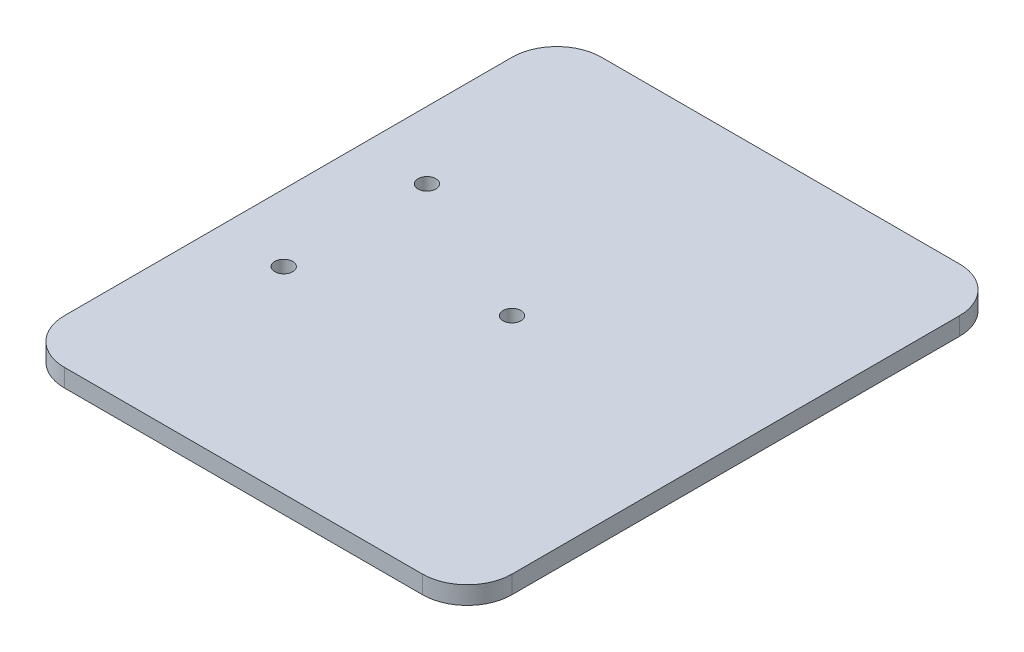
ISO-10303-21;
HEADER;
FILE_DESCRIPTION(('STEP AP214'),'2;1');
FILE_NAME('part.step','',(''),(''),'','','');
FILE_SCHEMA(('AUTOMOTIVE_DESIGN { 1 0 10303 214 1 1 1 1 }'));
ENDSEC;
DATA;
#1=APPLICATION_CONTEXT('core data for automotive mechanical design processes');
#2=APPLICATION_PROTOCOL_DEFINITION('international standard','automotive_design',2000,#1);
#3=PRODUCT_CONTEXT('',#1,'mechanical');
#4=PRODUCT('Part','Part','',(#3));
#5=PRODUCT_RELATED_PRODUCT_CATEGORY('part','',(#4));
#6=PRODUCT_DEFINITION_FORMATION('','',#4);
#7=PRODUCT_DEFINITION_CONTEXT('part definition',#1,'design');
#8=PRODUCT_DEFINITION('design','',#6,#7);
#9=PRODUCT_DEFINITION_SHAPE('','',#8);
#10=(LENGTH_UNIT() NAMED_UNIT(*) SI_UNIT(.MILLI.,.METRE.));
#11=(NAMED_UNIT(*) PLANE_ANGLE_UNIT() SI_UNIT($,.RADIAN.));
#12=(NAMED_UNIT(*) SI_UNIT($,.STERADIAN.) SOLID_ANGLE_UNIT());
#13=UNCERTAINTY_MEASURE_WITH_UNIT(LENGTH_MEASURE(1.E-05),#10,'distance_accuracy_value','');
#14=(GEOMETRIC_REPRESENTATION_CONTEXT(3) GLOBAL_UNCERTAINTY_ASSIGNED_CONTEXT((#13)) GLOBAL_UNIT_ASSIGNED_CONTEXT((#10,
#11,#12)) REPRESENTATION_CONTEXT('',''));
#15=CARTESIAN_POINT('',(0.,0.,0.));
#16=DIRECTION('',(0.,0.,1.));
#17=DIRECTION('',(1.,0.,0.));
#18=AXIS2_PLACEMENT_3D('',#15,#16,#17);
#19=CARTESIAN_POINT('',(-1.41509433962266,2.,-6.88679245283019));
#20=DIRECTION('',(0.,-1.,0.));
#21=DIRECTION('',(0.,0.,-1.));
#22=AXIS2_PLACEMENT_3D('',#19,#20,#21);
#23=CYLINDRICAL_SURFACE('',#22,5.);
#24=CARTESIAN_POINT('',(-1.41509433962266,0.,-6.88679245283019));
#25=DIRECTION('',(0.,1.,0.));
#26=DIRECTION('',(0.,0.,-1.));
#27=AXIS2_PLACEMENT_3D('',#24,#25,#26);
#28=CIRCLE('',#27,5.);
#29=CARTESIAN_POINT('',(3.58490566037734,0.,-6.88679245283016));
#30=VERTEX_POINT('',#29);
#31=CARTESIAN_POINT('',(-1.41509433962269,0.,-11.8867924528302));
#32=VERTEX_POINT('',#31);
#33=EDGE_CURVE('E144',#30,#32,#28,.T.);
#34=ORIENTED_EDGE('',*,*,#33,.T.);
#35=DIRECTION('',(0.,-1.,0.));
#36=VECTOR('',#35,1.);
#37=CARTESIAN_POINT('',(-1.41509433962269,2.,-11.8867924528302));
#38=LINE('',#37,#36);
#39=CARTESIAN_POINT('',(-1.41509433962269,2.,-11.8867924528302));
#40=VERTEX_POINT('',#39);
#41=EDGE_CURVE('E11',#40,#32,#38,.T.);
#42=ORIENTED_EDGE('',*,*,#41,.F.);
#43=CARTESIAN_POINT('',(-1.41509433962266,2.,-6.88679245283019));
#44=DIRECTION('',(0.,1.,0.));
#45=DIRECTION('',(0.,0.,-1.));
#46=AXIS2_PLACEMENT_3D('',#43,#44,#45);
#47=CIRCLE('',#46,5.);
#48=CARTESIAN_POINT('',(3.58490566037734,2.,-6.88679245283016));
#49=VERTEX_POINT('',#48);
#50=EDGE_CURVE('E167',#49,#40,#47,.T.);
#51=ORIENTED_EDGE('',*,*,#50,.F.);
#52=DIRECTION('',(0.,-1.,0.));
#53=VECTOR('',#52,1.);
#54=CARTESIAN_POINT('',(3.58490566037734,2.,-6.88679245283016));
#55=LINE('',#54,#53);
#56=EDGE_CURVE('E140',#49,#30,#55,.T.);
#57=ORIENTED_EDGE('',*,*,#56,.T.);
#58=EDGE_LOOP('',(#34,#42,#51,#57));
#59=FACE_BOUND('',#58,.T.);
#60=ADVANCED_FACE('F43',(#59),#23,.T.);
#61=CARTESIAN_POINT('',(-41.4150943396226,2.,-11.8867924528302));
#62=DIRECTION('',(0.,0.,1.));
#63=DIRECTION('',(1.,0.,0.));
#64=AXIS2_PLACEMENT_3D('',#61,#62,#63);
#65=PLANE('',#64);
#66=DIRECTION('',(-1.,0.,0.));
#67=VECTOR('',#66,1.);
#68=CARTESIAN_POINT('',(-41.4150943396226,0.,-11.8867924528302));
#69=LINE('',#68,#67);
#70=CARTESIAN_POINT('',(-41.4150943396226,0.,-11.8867924528302));
#71=VERTEX_POINT('',#70);
#72=EDGE_CURVE('E148',#32,#71,#69,.T.);
#73=ORIENTED_EDGE('',*,*,#72,.T.);
#74=DIRECTION('',(0.,-1.,0.));
#75=VECTOR('',#74,1.);
#76=CARTESIAN_POINT('',(-41.4150943396226,2.,-11.8867924528302));
#77=LINE('',#76,#75);
#78=CARTESIAN_POINT('',(-41.4150943396226,2.,-11.8867924528302));
#79=VERTEX_POINT('',#78);
#80=EDGE_CURVE('E52',#79,#71,#77,.T.);
#81=ORIENTED_EDGE('',*,*,#80,.F.);
#82=DIRECTION('',(-1.,0.,0.));
#83=VECTOR('',#82,1.);
#84=CARTESIAN_POINT('',(-41.4150943396226,2.,-11.8867924528302));
#85=LINE('',#84,#83);
#86=EDGE_CURVE('E103',#40,#79,#85,.T.);
#87=ORIENTED_EDGE('',*,*,#86,.F.);
#88=ORIENTED_EDGE('',*,*,#41,.T.);
#89=EDGE_LOOP('',(#73,#81,#87,#88));
#90=FACE_BOUND('',#89,.T.);
#91=ADVANCED_FACE('F265',(#90),#65,.F.);
#92=CARTESIAN_POINT('',(-41.4150943396227,2.,-6.88679245283019));
#93=DIRECTION('',(0.,-1.,0.));
#94=DIRECTION('',(0.,0.,-1.));
#95=AXIS2_PLACEMENT_3D('',#92,#93,#94);
#96=CYLINDRICAL_SURFACE('',#95,5.);
#97=CARTESIAN_POINT('',(-41.4150943396227,0.,-6.88679245283019));
#98=DIRECTION('',(0.,1.,0.));
#99=DIRECTION('',(0.,0.,1.));
#100=AXIS2_PLACEMENT_3D('',#97,#98,#99);
#101=CIRCLE('',#100,5.);
#102=CARTESIAN_POINT('',(-46.4150943396227,0.,-6.88679245283016));
#103=VERTEX_POINT('',#102);
#104=EDGE_CURVE('E152',#71,#103,#101,.T.);
#105=ORIENTED_EDGE('',*,*,#104,.T.);
#106=DIRECTION('',(0.,-1.,0.));
#107=VECTOR('',#106,1.);
#108=CARTESIAN_POINT('',(-46.4150943396227,2.,-6.88679245283016));
#109=LINE('',#108,#107);
#110=CARTESIAN_POINT('',(-46.4150943396227,2.,-6.88679245283016));
#111=VERTEX_POINT('',#110);
#112=EDGE_CURVE('E178',#111,#103,#109,.T.);
#113=ORIENTED_EDGE('',*,*,#112,.F.);
#114=CARTESIAN_POINT('',(-41.4150943396227,2.,-6.88679245283019));
#115=DIRECTION('',(0.,1.,0.));
#116=DIRECTION('',(0.,0.,1.));
#117=AXIS2_PLACEMENT_3D('',#114,#115,#116);
#118=CIRCLE('',#117,5.);
#119=EDGE_CURVE('E188',#79,#111,#118,.T.);
#120=ORIENTED_EDGE('',*,*,#119,.F.);
#121=ORIENTED_EDGE('',*,*,#80,.T.);
#122=EDGE_LOOP('',(#105,#113,#120,#121));
#123=FACE_BOUND('',#122,.T.);
#124=ADVANCED_FACE('F186',(#123),#96,.T.);
#125=CARTESIAN_POINT('',(-46.4150943396227,2.,-6.88679245283016));
#126=DIRECTION('',(1.,0.,0.));
#127=DIRECTION('',(0.,0.,-1.));
#128=AXIS2_PLACEMENT_3D('',#125,#126,#127);
#129=PLANE('',#128);
#130=DIRECTION('',(0.,0.,1.));
#131=VECTOR('',#130,1.);
#132=CARTESIAN_POINT('',(-46.4150943396227,0.,-6.88679245283016));
#133=LINE('',#132,#131);
#134=CARTESIAN_POINT('',(-46.4150943396227,0.,43.1132075471698));
#135=VERTEX_POINT('',#134);
#136=EDGE_CURVE('E155',#103,#135,#133,.T.);
#137=ORIENTED_EDGE('',*,*,#136,.T.);
#138=DIRECTION('',(0.,-1.,0.));
#139=VECTOR('',#138,1.);
#140=CARTESIAN_POINT('',(-46.4150943396227,2.,43.1132075471698));
#141=LINE('',#140,#139);
#142=CARTESIAN_POINT('',(-46.4150943396227,2.,43.1132075471698));
#143=VERTEX_POINT('',#142);
#144=EDGE_CURVE('E174',#143,#135,#141,.T.);
#145=ORIENTED_EDGE('',*,*,#144,.F.);
#146=DIRECTION('',(0.,0.,1.));
#147=VECTOR('',#146,1.);
#148=CARTESIAN_POINT('',(-46.4150943396227,2.,-6.88679245283016));
#149=LINE('',#148,#147);
#150=EDGE_CURVE('E201',#111,#143,#149,.T.);
#151=ORIENTED_EDGE('',*,*,#150,.F.);
#152=ORIENTED_EDGE('',*,*,#112,.T.);
#153=EDGE_LOOP('',(#137,#145,#151,#152));
#154=FACE_BOUND('',#153,.T.);
#155=ADVANCED_FACE('F196',(#154),#129,.F.);
#156=CARTESIAN_POINT('',(-41.4150943396227,2.,43.1132075471698));
#157=DIRECTION('',(0.,-1.,0.));
#158=DIRECTION('',(0.,0.,-1.));
#159=AXIS2_PLACEMENT_3D('',#156,#157,#158);
#160=CYLINDRICAL_SURFACE('',#159,5.);
#161=CARTESIAN_POINT('',(-41.4150943396227,0.,43.1132075471698));
#162=DIRECTION('',(0.,1.,0.));
#163=DIRECTION('',(0.,0.,1.));
#164=AXIS2_PLACEMENT_3D('',#161,#162,#163);
#165=CIRCLE('',#164,5.);
#166=CARTESIAN_POINT('',(-41.4150943396227,0.,48.1132075471698));
#167=VERTEX_POINT('',#166);
#168=EDGE_CURVE('E158',#135,#167,#165,.T.);
#169=ORIENTED_EDGE('',*,*,#168,.T.);
#170=DIRECTION('',(0.,-1.,0.));
#171=VECTOR('',#170,1.);
#172=CARTESIAN_POINT('',(-41.4150943396227,2.,48.1132075471698));
#173=LINE('',#172,#171);
#174=CARTESIAN_POINT('',(-41.4150943396227,2.,48.1132075471698));
#175=VERTEX_POINT('',#174);
#176=EDGE_CURVE('E133',#175,#167,#173,.T.);
#177=ORIENTED_EDGE('',*,*,#176,.F.);
#178=CARTESIAN_POINT('',(-41.4150943396227,2.,43.1132075471698));
#179=DIRECTION('',(0.,1.,0.));
#180=DIRECTION('',(0.,0.,1.));
#181=AXIS2_PLACEMENT_3D('',#178,#179,#180);
#182=CIRCLE('',#181,5.);
#183=EDGE_CURVE('E122',#143,#175,#182,.T.);
#184=ORIENTED_EDGE('',*,*,#183,.F.);
#185=ORIENTED_EDGE('',*,*,#144,.T.);
#186=EDGE_LOOP('',(#169,#177,#184,#185));
#187=FACE_BOUND('',#186,.T.);
#188=ADVANCED_FACE('F199',(#187),#160,.T.);
#189=CARTESIAN_POINT('',(-41.4150943396226,2.,48.1132075471698));
#190=DIRECTION('',(0.,0.,-1.));
#191=DIRECTION('',(-1.,0.,0.));
#192=AXIS2_PLACEMENT_3D('',#189,#190,#191);
#193=PLANE('',#192);
#194=DIRECTION('',(1.,0.,0.));
#195=VECTOR('',#194,1.);
#196=CARTESIAN_POINT('',(-41.4150943396226,0.,48.1132075471698));
#197=LINE('',#196,#195);
#198=CARTESIAN_POINT('',(-1.41509433962269,0.,48.1132075471698));
#199=VERTEX_POINT('',#198);
#200=EDGE_CURVE('E131',#167,#199,#197,.T.);
#201=ORIENTED_EDGE('',*,*,#200,.T.);
#202=DIRECTION('',(0.,-1.,0.));
#203=VECTOR('',#202,1.);
#204=CARTESIAN_POINT('',(-1.41509433962269,2.,48.1132075471698));
#205=LINE('',#204,#203);
#206=CARTESIAN_POINT('',(-1.41509433962269,2.,48.1132075471698));
#207=VERTEX_POINT('',#206);
#208=EDGE_CURVE('E128',#207,#199,#205,.T.);
#209=ORIENTED_EDGE('',*,*,#208,.F.);
#210=DIRECTION('',(1.,0.,0.));
#211=VECTOR('',#210,1.);
#212=CARTESIAN_POINT('',(-41.4150943396226,2.,48.1132075471698));
#213=LINE('',#212,#211);
#214=EDGE_CURVE('E116',#175,#207,#213,.T.);
#215=ORIENTED_EDGE('',*,*,#214,.F.);
#216=ORIENTED_EDGE('',*,*,#176,.T.);
#217=EDGE_LOOP('',(#201,#209,#215,#216));
#218=FACE_BOUND('',#217,.T.);
#219=ADVANCED_FACE('F129',(#218),#193,.F.);
#220=CARTESIAN_POINT('',(-1.41509433962265,2.,43.1132075471698));
#221=DIRECTION('',(0.,-1.,0.));
#222=DIRECTION('',(0.,0.,-1.));
#223=AXIS2_PLACEMENT_3D('',#220,#221,#222);
#224=CYLINDRICAL_SURFACE('',#223,5.);
#225=CARTESIAN_POINT('',(-1.41509433962265,0.,43.1132075471698));
#226=DIRECTION('',(0.,1.,0.));
#227=DIRECTION('',(0.,0.,1.));
#228=AXIS2_PLACEMENT_3D('',#225,#226,#227);
#229=CIRCLE('',#228,5.);
#230=CARTESIAN_POINT('',(3.58490566037735,0.,43.1132075471698));
#231=VERTEX_POINT('',#230);
#232=EDGE_CURVE('E89',#199,#231,#229,.T.);
#233=ORIENTED_EDGE('',*,*,#232,.T.);
#234=DIRECTION('',(0.,-1.,0.));
#235=VECTOR('',#234,1.);
#236=CARTESIAN_POINT('',(3.58490566037735,2.,43.1132075471698));
#237=LINE('',#236,#235);
#238=CARTESIAN_POINT('',(3.58490566037735,2.,43.1132075471698));
#239=VERTEX_POINT('',#238);
#240=EDGE_CURVE('E134',#239,#231,#237,.T.);
#241=ORIENTED_EDGE('',*,*,#240,.F.);
#242=CARTESIAN_POINT('',(-1.41509433962265,2.,43.1132075471698));
#243=DIRECTION('',(0.,1.,0.));
#244=DIRECTION('',(0.,0.,1.));
#245=AXIS2_PLACEMENT_3D('',#242,#243,#244);
#246=CIRCLE('',#245,5.);
#247=EDGE_CURVE('E120',#207,#239,#246,.T.);
#248=ORIENTED_EDGE('',*,*,#247,.F.);
#249=ORIENTED_EDGE('',*,*,#208,.T.);
#250=EDGE_LOOP('',(#233,#241,#248,#249));
#251=FACE_BOUND('',#250,.T.);
#252=ADVANCED_FACE('F136',(#251),#224,.T.);
#253=CARTESIAN_POINT('',(3.58490566037734,2.,-6.88679245283016));
#254=DIRECTION('',(-1.,0.,0.));
#255=DIRECTION('',(0.,0.,1.));
#256=AXIS2_PLACEMENT_3D('',#253,#254,#255);
#257=PLANE('',#256);
#258=DIRECTION('',(0.,0.,-1.));
#259=VECTOR('',#258,1.);
#260=CARTESIAN_POINT('',(3.58490566037734,0.,-6.88679245283016));
#261=LINE('',#260,#259);
#262=EDGE_CURVE('E95',#231,#30,#261,.T.);
#263=ORIENTED_EDGE('',*,*,#262,.T.);
#264=ORIENTED_EDGE('',*,*,#56,.F.);
#265=DIRECTION('',(0.,0.,-1.));
#266=VECTOR('',#265,1.);
#267=CARTESIAN_POINT('',(3.58490566037734,2.,-6.88679245283016));
#268=LINE('',#267,#266);
#269=EDGE_CURVE('E60',#239,#49,#268,.T.);
#270=ORIENTED_EDGE('',*,*,#269,.F.);
#271=ORIENTED_EDGE('',*,*,#240,.T.);
#272=EDGE_LOOP('',(#263,#264,#270,#271));
#273=FACE_BOUND('',#272,.T.);
#274=ADVANCED_FACE('F246',(#273),#257,.F.);
#275=CARTESIAN_POINT('',(-1.41509433962266,2.,-6.88679245283019));
#276=DIRECTION('',(0.,-1.,0.));
#277=DIRECTION('',(0.,0.,-1.));
#278=AXIS2_PLACEMENT_3D('',#275,#276,#277);
#279=PLANE('',#278);
#280=CARTESIAN_POINT('',(-38.9150943396227,2.,10.1132075471698));
#281=DIRECTION('',(0.,1.,0.));
#282=DIRECTION('',(0.,0.,1.));
#283=AXIS2_PLACEMENT_3D('',#280,#281,#282);
#284=CIRCLE('',#283,0.999999999999998);
#285=CARTESIAN_POINT('',(-38.9150943396227,2.,11.1132075471698));
#286=VERTEX_POINT('',#285);
#287=EDGE_CURVE('E227',#286,#286,#284,.T.);
#288=ORIENTED_EDGE('',*,*,#287,.F.);
#289=EDGE_LOOP('',(#288));
#290=FACE_BOUND('',#289,.T.);
#291=CARTESIAN_POINT('',(-38.9150943396227,2.,26.1132075471698));
#292=DIRECTION('',(0.,1.,0.));
#293=DIRECTION('',(0.,0.,1.));
#294=AXIS2_PLACEMENT_3D('',#291,#292,#293);
#295=CIRCLE('',#294,0.999999999999998);
#296=CARTESIAN_POINT('',(-38.9150943396227,2.,27.1132075471698));
#297=VERTEX_POINT('',#296);
#298=EDGE_CURVE('E223',#297,#297,#295,.T.);
#299=ORIENTED_EDGE('',*,*,#298,.F.);
#300=EDGE_LOOP('',(#299));
#301=FACE_BOUND('',#300,.T.);
#302=CARTESIAN_POINT('',(-21.4150943396227,2.,18.1132075471698));
#303=DIRECTION('',(0.,1.,0.));
#304=DIRECTION('',(0.,0.,1.));
#305=AXIS2_PLACEMENT_3D('',#302,#303,#304);
#306=CIRCLE('',#305,1.);
#307=CARTESIAN_POINT('',(-21.4150943396227,2.,19.1132075471698));
#308=VERTEX_POINT('',#307);
#309=EDGE_CURVE('E215',#308,#308,#306,.T.);
#310=ORIENTED_EDGE('',*,*,#309,.F.);
#311=EDGE_LOOP('',(#310));
#312=FACE_BOUND('',#311,.T.);
#313=ORIENTED_EDGE('',*,*,#50,.T.);
#314=ORIENTED_EDGE('',*,*,#86,.T.);
#315=ORIENTED_EDGE('',*,*,#119,.T.);
#316=ORIENTED_EDGE('',*,*,#150,.T.);
#317=ORIENTED_EDGE('',*,*,#183,.T.);
#318=ORIENTED_EDGE('',*,*,#214,.T.);
#319=ORIENTED_EDGE('',*,*,#247,.T.);
#320=ORIENTED_EDGE('',*,*,#269,.T.);
#321=EDGE_LOOP('',(#313,#314,#315,#316,#317,#318,#319,#320));
#322=FACE_BOUND('',#321,.T.);
#323=ADVANCED_FACE('F118',(#290,#301,#312,#322),#279,.F.);
#324=CARTESIAN_POINT('',(-1.41509433962266,0.,-6.88679245283019));
#325=DIRECTION('',(0.,-1.,0.));
#326=DIRECTION('',(0.,0.,-1.));
#327=AXIS2_PLACEMENT_3D('',#324,#325,#326);
#328=PLANE('',#327);
#329=CARTESIAN_POINT('',(-38.9150943396227,0.,10.1132075471698));
#330=DIRECTION('',(0.,1.,0.));
#331=DIRECTION('',(0.,0.,1.));
#332=AXIS2_PLACEMENT_3D('',#329,#330,#331);
#333=CIRCLE('',#332,0.999999999999998);
#334=CARTESIAN_POINT('',(-38.9150943396227,0.,11.1132075471698));
#335=VERTEX_POINT('',#334);
#336=EDGE_CURVE('E149',#335,#335,#333,.T.);
#337=ORIENTED_EDGE('',*,*,#336,.T.);
#338=EDGE_LOOP('',(#337));
#339=FACE_BOUND('',#338,.T.);
#340=CARTESIAN_POINT('',(-38.9150943396227,0.,26.1132075471698));
#341=DIRECTION('',(0.,1.,0.));
#342=DIRECTION('',(0.,0.,1.));
#343=AXIS2_PLACEMENT_3D('',#340,#341,#342);
#344=CIRCLE('',#343,0.999999999999998);
#345=CARTESIAN_POINT('',(-38.9150943396227,0.,27.1132075471698));
#346=VERTEX_POINT('',#345);
#347=EDGE_CURVE('E219',#346,#346,#344,.T.);
#348=ORIENTED_EDGE('',*,*,#347,.T.);
#349=EDGE_LOOP('',(#348));
#350=FACE_BOUND('',#349,.T.);
#351=CARTESIAN_POINT('',(-21.4150943396227,0.,18.1132075471698));
#352=DIRECTION('',(0.,1.,0.));
#353=DIRECTION('',(0.,0.,1.));
#354=AXIS2_PLACEMENT_3D('',#351,#352,#353);
#355=CIRCLE('',#354,1.);
#356=CARTESIAN_POINT('',(-21.4150943396227,0.,19.1132075471698));
#357=VERTEX_POINT('',#356);
#358=EDGE_CURVE('E211',#357,#357,#355,.T.);
#359=ORIENTED_EDGE('',*,*,#358,.T.);
#360=EDGE_LOOP('',(#359));
#361=FACE_BOUND('',#360,.T.);
#362=ORIENTED_EDGE('',*,*,#33,.F.);
#363=ORIENTED_EDGE('',*,*,#262,.F.);
#364=ORIENTED_EDGE('',*,*,#232,.F.);
#365=ORIENTED_EDGE('',*,*,#200,.F.);
#366=ORIENTED_EDGE('',*,*,#168,.F.);
#367=ORIENTED_EDGE('',*,*,#136,.F.);
#368=ORIENTED_EDGE('',*,*,#104,.F.);
#369=ORIENTED_EDGE('',*,*,#72,.F.);
#370=EDGE_LOOP('',(#362,#363,#364,#365,#366,#367,#368,#369));
#371=FACE_BOUND('',#370,.T.);
#372=ADVANCED_FACE('F192',(#339,#350,#361,#371),#328,.T.);
#373=CARTESIAN_POINT('',(-21.4150943396227,0.,18.1132075471698));
#374=DIRECTION('',(0.,1.,0.));
#375=DIRECTION('',(0.,0.,1.));
#376=AXIS2_PLACEMENT_3D('',#373,#374,#375);
#377=CYLINDRICAL_SURFACE('',#376,1.);
#378=ORIENTED_EDGE('',*,*,#358,.F.);
#379=EDGE_LOOP('',(#378));
#380=FACE_BOUND('',#379,.T.);
#381=ORIENTED_EDGE('',*,*,#309,.T.);
#382=EDGE_LOOP('',(#381));
#383=FACE_BOUND('',#382,.T.);
#384=ADVANCED_FACE('F252',(#380,#383),#377,.F.);
#385=CARTESIAN_POINT('',(-38.9150943396227,0.,26.1132075471698));
#386=DIRECTION('',(0.,1.,0.));
#387=DIRECTION('',(0.,0.,1.));
#388=AXIS2_PLACEMENT_3D('',#385,#386,#387);
#389=CYLINDRICAL_SURFACE('',#388,0.999999999999998);
#390=ORIENTED_EDGE('',*,*,#347,.F.);
#391=EDGE_LOOP('',(#390));
#392=FACE_BOUND('',#391,.T.);
#393=ORIENTED_EDGE('',*,*,#298,.T.);
#394=EDGE_LOOP('',(#393));
#395=FACE_BOUND('',#394,.T.);
#396=ADVANCED_FACE('F240',(#392,#395),#389,.F.);
#397=CARTESIAN_POINT('',(-38.9150943396227,0.,10.1132075471698));
#398=DIRECTION('',(0.,1.,0.));
#399=DIRECTION('',(0.,0.,1.));
#400=AXIS2_PLACEMENT_3D('',#397,#398,#399);
#401=CYLINDRICAL_SURFACE('',#400,0.999999999999998);
#402=ORIENTED_EDGE('',*,*,#336,.F.);
#403=EDGE_LOOP('',(#402));
#404=FACE_BOUND('',#403,.T.);
#405=ORIENTED_EDGE('',*,*,#287,.T.);
#406=EDGE_LOOP('',(#405));
#407=FACE_BOUND('',#406,.T.);
#408=ADVANCED_FACE('F237',(#404,#407),#401,.F.);
#409=CLOSED_SHELL('',(#60,#91,#124,#155,#188,#219,#252,#274,#323,#372,#384,#396,#408));
#410=MANIFOLD_SOLID_BREP('B2',#409);
#411=ADVANCED_BREP_SHAPE_REPRESENTATION('',(#18,#410),#14);
#412=SHAPE_DEFINITION_REPRESENTATION(#9,#411);
ENDSEC;
END-ISO-10303-21;
